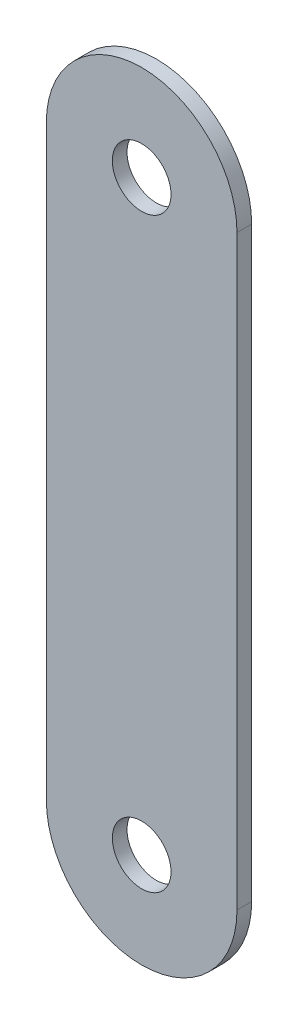
ISO-10303-21;
HEADER;
FILE_DESCRIPTION(('STEP AP214'),'2;1');
FILE_NAME('part.step','',(''),(''),'','','');
FILE_SCHEMA(('AUTOMOTIVE_DESIGN { 1 0 10303 214 1 1 1 1 }'));
ENDSEC;
DATA;
#1=APPLICATION_CONTEXT('core data for automotive mechanical design processes');
#2=APPLICATION_PROTOCOL_DEFINITION('international standard','automotive_design',2000,#1);
#3=PRODUCT_CONTEXT('',#1,'mechanical');
#4=PRODUCT('Part','Part','',(#3));
#5=PRODUCT_RELATED_PRODUCT_CATEGORY('part','',(#4));
#6=PRODUCT_DEFINITION_FORMATION('','',#4);
#7=PRODUCT_DEFINITION_CONTEXT('part definition',#1,'design');
#8=PRODUCT_DEFINITION('design','',#6,#7);
#9=PRODUCT_DEFINITION_SHAPE('','',#8);
#10=(LENGTH_UNIT() NAMED_UNIT(*) SI_UNIT(.MILLI.,.METRE.));
#11=(NAMED_UNIT(*) PLANE_ANGLE_UNIT() SI_UNIT($,.RADIAN.));
#12=(NAMED_UNIT(*) SI_UNIT($,.STERADIAN.) SOLID_ANGLE_UNIT());
#13=UNCERTAINTY_MEASURE_WITH_UNIT(LENGTH_MEASURE(1.E-05),#10,'distance_accuracy_value','');
#14=(GEOMETRIC_REPRESENTATION_CONTEXT(3) GLOBAL_UNCERTAINTY_ASSIGNED_CONTEXT((#13)) GLOBAL_UNIT_ASSIGNED_CONTEXT((#10,
#11,#12)) REPRESENTATION_CONTEXT('',''));
#15=CARTESIAN_POINT('',(0.,0.,0.));
#16=DIRECTION('',(0.,0.,1.));
#17=DIRECTION('',(1.,0.,0.));
#18=AXIS2_PLACEMENT_3D('',#15,#16,#17);
#19=CARTESIAN_POINT('',(0.,-20.,1.));
#20=DIRECTION('',(0.,0.,-1.));
#21=DIRECTION('',(-1.,0.,0.));
#22=AXIS2_PLACEMENT_3D('',#19,#20,#21);
#23=CYLINDRICAL_SURFACE('',#22,6.50000000000001);
#24=CARTESIAN_POINT('',(0.,-20.,0.));
#25=DIRECTION('',(0.,0.,1.));
#26=DIRECTION('',(1.,0.,0.));
#27=AXIS2_PLACEMENT_3D('',#24,#25,#26);
#28=CIRCLE('',#27,6.50000000000001);
#29=CARTESIAN_POINT('',(-6.50000000000001,-20.,0.));
#30=VERTEX_POINT('',#29);
#31=CARTESIAN_POINT('',(6.50000000000001,-20.,0.));
#32=VERTEX_POINT('',#31);
#33=EDGE_CURVE('E94',#30,#32,#28,.T.);
#34=ORIENTED_EDGE('',*,*,#33,.T.);
#35=DIRECTION('',(0.,0.,-1.));
#36=VECTOR('',#35,1.);
#37=CARTESIAN_POINT('',(6.50000000000001,-20.,1.));
#38=LINE('',#37,#36);
#39=CARTESIAN_POINT('',(6.50000000000001,-20.,1.));
#40=VERTEX_POINT('',#39);
#41=EDGE_CURVE('E11',#40,#32,#38,.T.);
#42=ORIENTED_EDGE('',*,*,#41,.F.);
#43=CARTESIAN_POINT('',(0.,-20.,1.));
#44=DIRECTION('',(0.,0.,1.));
#45=DIRECTION('',(1.,0.,0.));
#46=AXIS2_PLACEMENT_3D('',#43,#44,#45);
#47=CIRCLE('',#46,6.50000000000001);
#48=CARTESIAN_POINT('',(-6.50000000000001,-20.,1.));
#49=VERTEX_POINT('',#48);
#50=EDGE_CURVE('E82',#49,#40,#47,.T.);
#51=ORIENTED_EDGE('',*,*,#50,.F.);
#52=DIRECTION('',(0.,0.,-1.));
#53=VECTOR('',#52,1.);
#54=CARTESIAN_POINT('',(-6.50000000000001,-20.,1.));
#55=LINE('',#54,#53);
#56=EDGE_CURVE('E90',#49,#30,#55,.T.);
#57=ORIENTED_EDGE('',*,*,#56,.T.);
#58=EDGE_LOOP('',(#34,#42,#51,#57));
#59=FACE_BOUND('',#58,.T.);
#60=ADVANCED_FACE('F31',(#59),#23,.T.);
#61=CARTESIAN_POINT('',(6.50000000000001,-20.,1.));
#62=DIRECTION('',(-1.,0.,0.));
#63=DIRECTION('',(0.,-1.,0.));
#64=AXIS2_PLACEMENT_3D('',#61,#62,#63);
#65=PLANE('',#64);
#66=DIRECTION('',(0.,1.,0.));
#67=VECTOR('',#66,1.);
#68=CARTESIAN_POINT('',(6.50000000000001,-20.,0.));
#69=LINE('',#68,#67);
#70=CARTESIAN_POINT('',(6.5,20.,0.));
#71=VERTEX_POINT('',#70);
#72=EDGE_CURVE('E86',#32,#71,#69,.T.);
#73=ORIENTED_EDGE('',*,*,#72,.T.);
#74=DIRECTION('',(0.,0.,-1.));
#75=VECTOR('',#74,1.);
#76=CARTESIAN_POINT('',(6.5,20.,1.));
#77=LINE('',#76,#75);
#78=CARTESIAN_POINT('',(6.5,20.,1.));
#79=VERTEX_POINT('',#78);
#80=EDGE_CURVE('E39',#79,#71,#77,.T.);
#81=ORIENTED_EDGE('',*,*,#80,.F.);
#82=DIRECTION('',(0.,1.,0.));
#83=VECTOR('',#82,1.);
#84=CARTESIAN_POINT('',(6.50000000000001,-20.,1.));
#85=LINE('',#84,#83);
#86=EDGE_CURVE('E77',#40,#79,#85,.T.);
#87=ORIENTED_EDGE('',*,*,#86,.F.);
#88=ORIENTED_EDGE('',*,*,#41,.T.);
#89=EDGE_LOOP('',(#73,#81,#87,#88));
#90=FACE_BOUND('',#89,.T.);
#91=ADVANCED_FACE('F85',(#90),#65,.F.);
#92=CARTESIAN_POINT('',(0.,20.,1.));
#93=DIRECTION('',(0.,0.,-1.));
#94=DIRECTION('',(-1.,0.,0.));
#95=AXIS2_PLACEMENT_3D('',#92,#93,#94);
#96=CYLINDRICAL_SURFACE('',#95,6.50000000000001);
#97=CARTESIAN_POINT('',(0.,20.,0.));
#98=DIRECTION('',(0.,0.,1.));
#99=DIRECTION('',(1.,0.,0.));
#100=AXIS2_PLACEMENT_3D('',#97,#98,#99);
#101=CIRCLE('',#100,6.50000000000001);
#102=CARTESIAN_POINT('',(-6.50000000000001,20.,0.));
#103=VERTEX_POINT('',#102);
#104=EDGE_CURVE('E64',#71,#103,#101,.T.);
#105=ORIENTED_EDGE('',*,*,#104,.T.);
#106=DIRECTION('',(0.,0.,-1.));
#107=VECTOR('',#106,1.);
#108=CARTESIAN_POINT('',(-6.50000000000001,20.,1.));
#109=LINE('',#108,#107);
#110=CARTESIAN_POINT('',(-6.50000000000001,20.,1.));
#111=VERTEX_POINT('',#110);
#112=EDGE_CURVE('E87',#111,#103,#109,.T.);
#113=ORIENTED_EDGE('',*,*,#112,.F.);
#114=CARTESIAN_POINT('',(0.,20.,1.));
#115=DIRECTION('',(0.,0.,1.));
#116=DIRECTION('',(1.,0.,0.));
#117=AXIS2_PLACEMENT_3D('',#114,#115,#116);
#118=CIRCLE('',#117,6.50000000000001);
#119=EDGE_CURVE('E80',#79,#111,#118,.T.);
#120=ORIENTED_EDGE('',*,*,#119,.F.);
#121=ORIENTED_EDGE('',*,*,#80,.T.);
#122=EDGE_LOOP('',(#105,#113,#120,#121));
#123=FACE_BOUND('',#122,.T.);
#124=ADVANCED_FACE('F88',(#123),#96,.T.);
#125=CARTESIAN_POINT('',(-6.50000000000001,-20.,1.));
#126=DIRECTION('',(1.,0.,0.));
#127=DIRECTION('',(0.,1.,0.));
#128=AXIS2_PLACEMENT_3D('',#125,#126,#127);
#129=PLANE('',#128);
#130=DIRECTION('',(0.,-1.,0.));
#131=VECTOR('',#130,1.);
#132=CARTESIAN_POINT('',(-6.50000000000001,-20.,0.));
#133=LINE('',#132,#131);
#134=EDGE_CURVE('E70',#103,#30,#133,.T.);
#135=ORIENTED_EDGE('',*,*,#134,.T.);
#136=ORIENTED_EDGE('',*,*,#56,.F.);
#137=DIRECTION('',(0.,-1.,0.));
#138=VECTOR('',#137,1.);
#139=CARTESIAN_POINT('',(-6.50000000000001,-20.,1.));
#140=LINE('',#139,#138);
#141=EDGE_CURVE('E47',#111,#49,#140,.T.);
#142=ORIENTED_EDGE('',*,*,#141,.F.);
#143=ORIENTED_EDGE('',*,*,#112,.T.);
#144=EDGE_LOOP('',(#135,#136,#142,#143));
#145=FACE_BOUND('',#144,.T.);
#146=ADVANCED_FACE('F102',(#145),#129,.F.);
#147=CARTESIAN_POINT('',(0.,-20.,1.));
#148=DIRECTION('',(0.,0.,1.));
#149=DIRECTION('',(1.,0.,0.));
#150=AXIS2_PLACEMENT_3D('',#147,#148,#149);
#151=PLANE('',#150);
#152=CARTESIAN_POINT('',(0.,20.,1.));
#153=DIRECTION('',(0.,0.,1.));
#154=DIRECTION('',(1.,0.,0.));
#155=AXIS2_PLACEMENT_3D('',#152,#153,#154);
#156=CIRCLE('',#155,2.);
#157=CARTESIAN_POINT('',(1.99999999999999,20.,1.));
#158=VERTEX_POINT('',#157);
#159=EDGE_CURVE('E114',#158,#158,#156,.T.);
#160=ORIENTED_EDGE('',*,*,#159,.F.);
#161=EDGE_LOOP('',(#160));
#162=FACE_BOUND('',#161,.T.);
#163=CARTESIAN_POINT('',(0.,-20.,1.));
#164=DIRECTION('',(0.,0.,1.));
#165=DIRECTION('',(1.,0.,0.));
#166=AXIS2_PLACEMENT_3D('',#163,#164,#165);
#167=CIRCLE('',#166,2.);
#168=CARTESIAN_POINT('',(2.,-20.,1.));
#169=VERTEX_POINT('',#168);
#170=EDGE_CURVE('E108',#169,#169,#167,.T.);
#171=ORIENTED_EDGE('',*,*,#170,.F.);
#172=EDGE_LOOP('',(#171));
#173=FACE_BOUND('',#172,.T.);
#174=ORIENTED_EDGE('',*,*,#50,.T.);
#175=ORIENTED_EDGE('',*,*,#86,.T.);
#176=ORIENTED_EDGE('',*,*,#119,.T.);
#177=ORIENTED_EDGE('',*,*,#141,.T.);
#178=EDGE_LOOP('',(#174,#175,#176,#177));
#179=FACE_BOUND('',#178,.T.);
#180=ADVANCED_FACE('F78',(#162,#173,#179),#151,.T.);
#181=CARTESIAN_POINT('',(0.,-20.,0.));
#182=DIRECTION('',(0.,0.,1.));
#183=DIRECTION('',(1.,0.,0.));
#184=AXIS2_PLACEMENT_3D('',#181,#182,#183);
#185=PLANE('',#184);
#186=CARTESIAN_POINT('',(0.,20.,0.));
#187=DIRECTION('',(0.,0.,1.));
#188=DIRECTION('',(1.,0.,0.));
#189=AXIS2_PLACEMENT_3D('',#186,#187,#188);
#190=CIRCLE('',#189,2.);
#191=CARTESIAN_POINT('',(1.99999999999999,20.,0.));
#192=VERTEX_POINT('',#191);
#193=EDGE_CURVE('E111',#192,#192,#190,.T.);
#194=ORIENTED_EDGE('',*,*,#193,.T.);
#195=EDGE_LOOP('',(#194));
#196=FACE_BOUND('',#195,.T.);
#197=CARTESIAN_POINT('',(0.,-20.,0.));
#198=DIRECTION('',(0.,0.,1.));
#199=DIRECTION('',(1.,0.,0.));
#200=AXIS2_PLACEMENT_3D('',#197,#198,#199);
#201=CIRCLE('',#200,2.);
#202=CARTESIAN_POINT('',(2.,-20.,0.));
#203=VERTEX_POINT('',#202);
#204=EDGE_CURVE('E97',#203,#203,#201,.T.);
#205=ORIENTED_EDGE('',*,*,#204,.T.);
#206=EDGE_LOOP('',(#205));
#207=FACE_BOUND('',#206,.T.);
#208=ORIENTED_EDGE('',*,*,#33,.F.);
#209=ORIENTED_EDGE('',*,*,#134,.F.);
#210=ORIENTED_EDGE('',*,*,#104,.F.);
#211=ORIENTED_EDGE('',*,*,#72,.F.);
#212=EDGE_LOOP('',(#208,#209,#210,#211));
#213=FACE_BOUND('',#212,.T.);
#214=ADVANCED_FACE('F105',(#196,#207,#213),#185,.F.);
#215=CARTESIAN_POINT('',(0.,-20.,0.));
#216=DIRECTION('',(0.,0.,1.));
#217=DIRECTION('',(1.,0.,0.));
#218=AXIS2_PLACEMENT_3D('',#215,#216,#217);
#219=CYLINDRICAL_SURFACE('',#218,2.);
#220=ORIENTED_EDGE('',*,*,#204,.F.);
#221=EDGE_LOOP('',(#220));
#222=FACE_BOUND('',#221,.T.);
#223=ORIENTED_EDGE('',*,*,#170,.T.);
#224=EDGE_LOOP('',(#223));
#225=FACE_BOUND('',#224,.T.);
#226=ADVANCED_FACE('F125',(#222,#225),#219,.F.);
#227=CARTESIAN_POINT('',(0.,20.,0.));
#228=DIRECTION('',(0.,0.,1.));
#229=DIRECTION('',(1.,0.,0.));
#230=AXIS2_PLACEMENT_3D('',#227,#228,#229);
#231=CYLINDRICAL_SURFACE('',#230,2.);
#232=ORIENTED_EDGE('',*,*,#193,.F.);
#233=EDGE_LOOP('',(#232));
#234=FACE_BOUND('',#233,.T.);
#235=ORIENTED_EDGE('',*,*,#159,.T.);
#236=EDGE_LOOP('',(#235));
#237=FACE_BOUND('',#236,.T.);
#238=ADVANCED_FACE('F122',(#234,#237),#231,.F.);
#239=CLOSED_SHELL('',(#60,#91,#124,#146,#180,#214,#226,#238));
#240=MANIFOLD_SOLID_BREP('B2',#239);
#241=ADVANCED_BREP_SHAPE_REPRESENTATION('',(#18,#240),#14);
#242=SHAPE_DEFINITION_REPRESENTATION(#9,#241);
ENDSEC;
END-ISO-10303-21;
